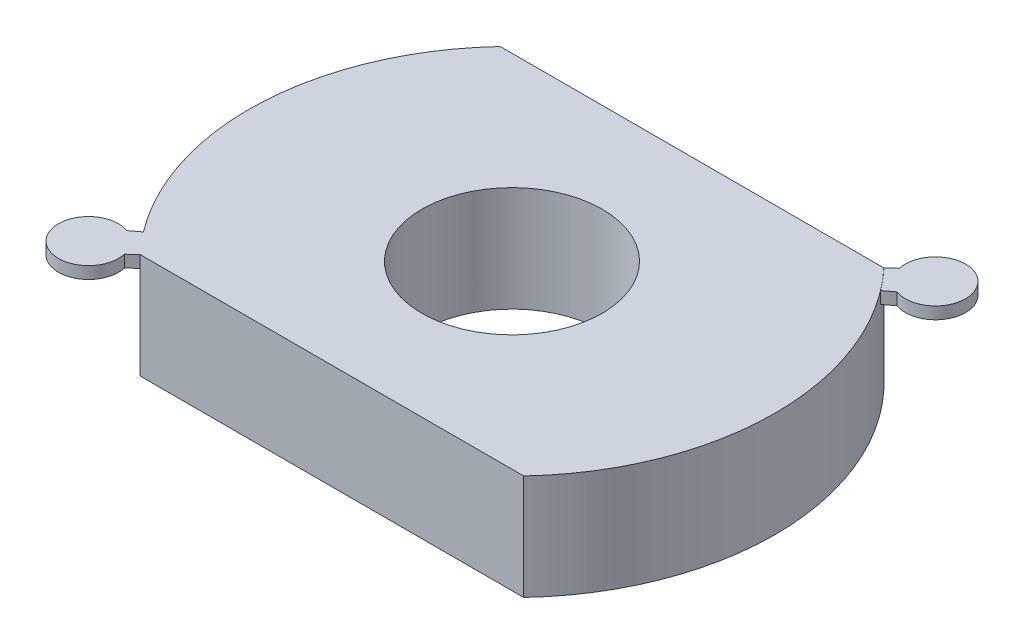
ISO-10303-21;
HEADER;
FILE_DESCRIPTION(('STEP AP214'),'2;1');
FILE_NAME('part.step','',(''),(''),'','','');
FILE_SCHEMA(('AUTOMOTIVE_DESIGN { 1 0 10303 214 1 1 1 1 }'));
ENDSEC;
DATA;
#1=APPLICATION_CONTEXT('core data for automotive mechanical design processes');
#2=APPLICATION_PROTOCOL_DEFINITION('international standard','automotive_design',2000,#1);
#3=PRODUCT_CONTEXT('',#1,'mechanical');
#4=PRODUCT('Part','Part','',(#3));
#5=PRODUCT_RELATED_PRODUCT_CATEGORY('part','',(#4));
#6=PRODUCT_DEFINITION_FORMATION('','',#4);
#7=PRODUCT_DEFINITION_CONTEXT('part definition',#1,'design');
#8=PRODUCT_DEFINITION('design','',#6,#7);
#9=PRODUCT_DEFINITION_SHAPE('','',#8);
#10=(LENGTH_UNIT() NAMED_UNIT(*) SI_UNIT(.MILLI.,.METRE.));
#11=(NAMED_UNIT(*) PLANE_ANGLE_UNIT() SI_UNIT($,.RADIAN.));
#12=(NAMED_UNIT(*) SI_UNIT($,.STERADIAN.) SOLID_ANGLE_UNIT());
#13=UNCERTAINTY_MEASURE_WITH_UNIT(LENGTH_MEASURE(1.E-05),#10,'distance_accuracy_value','');
#14=(GEOMETRIC_REPRESENTATION_CONTEXT(3) GLOBAL_UNCERTAINTY_ASSIGNED_CONTEXT((#13)) GLOBAL_UNIT_ASSIGNED_CONTEXT((#10,
#11,#12)) REPRESENTATION_CONTEXT('',''));
#15=CARTESIAN_POINT('',(0.,0.,0.));
#16=DIRECTION('',(0.,0.,1.));
#17=DIRECTION('',(1.,0.,0.));
#18=AXIS2_PLACEMENT_3D('',#15,#16,#17);
#19=CARTESIAN_POINT('',(1524.5473496291,620.,-1292.27368222175));
#20=DIRECTION('',(0.,1.,0.));
#21=DIRECTION('',(0.,0.,1.));
#22=AXIS2_PLACEMENT_3D('',#19,#20,#21);
#23=CYLINDRICAL_SURFACE('',#22,199.999999999983);
#24=CARTESIAN_POINT('',(1524.5473496291,700.,-1292.27368222175));
#25=DIRECTION('',(0.,1.,0.));
#26=DIRECTION('',(0.,0.,1.));
#27=AXIS2_PLACEMENT_3D('',#24,#25,#26);
#28=CIRCLE('',#27,199.999999999983);
#29=CARTESIAN_POINT('',(1329.42736665717,700.,-1248.36249634589));
#30=VERTEX_POINT('',#29);
#31=CARTESIAN_POINT('',(1456.88666030893,700.,-1104.06626706306));
#32=VERTEX_POINT('',#31);
#33=EDGE_CURVE('E116',#30,#32,#28,.F.);
#34=ORIENTED_EDGE('',*,*,#33,.T.);
#35=DIRECTION('',(0.,1.,0.));
#36=VECTOR('',#35,1.);
#37=CARTESIAN_POINT('',(1456.88666030893,620.,-1104.06626706306));
#38=LINE('',#37,#36);
#39=CARTESIAN_POINT('',(1456.88666030893,620.,-1104.06626706306));
#40=VERTEX_POINT('',#39);
#41=EDGE_CURVE('E12',#40,#32,#38,.T.);
#42=ORIENTED_EDGE('',*,*,#41,.F.);
#43=CARTESIAN_POINT('',(1524.5473496291,620.,-1292.27368222175));
#44=DIRECTION('',(0.,1.,0.));
#45=DIRECTION('',(0.,0.,1.));
#46=AXIS2_PLACEMENT_3D('',#43,#44,#45);
#47=CIRCLE('',#46,199.999999999983);
#48=CARTESIAN_POINT('',(1329.42736665717,620.,-1248.36249634589));
#49=VERTEX_POINT('',#48);
#50=EDGE_CURVE('E109',#49,#40,#47,.F.);
#51=ORIENTED_EDGE('',*,*,#50,.F.);
#52=DIRECTION('',(0.,1.,0.));
#53=VECTOR('',#52,1.);
#54=CARTESIAN_POINT('',(1329.42736665717,620.,-1248.36249634589));
#55=LINE('',#54,#53);
#56=EDGE_CURVE('E55',#49,#30,#55,.T.);
#57=ORIENTED_EDGE('',*,*,#56,.T.);
#58=EDGE_LOOP('',(#34,#42,#51,#57));
#59=FACE_BOUND('',#58,.T.);
#60=ADVANCED_FACE('F52',(#59),#23,.T.);
#61=CARTESIAN_POINT('',(4.88836242231465E-11,620.,6.45050955389637E-11));
#62=DIRECTION('',(-0.603984284872104,0.,-0.796996225604321));
#63=DIRECTION('',(-0.796996225604321,0.,0.603984284872104));
#64=AXIS2_PLACEMENT_3D('',#61,#62,#63);
#65=PLANE('',#64);
#66=DIRECTION('',(-0.796996225604321,0.,0.603984284872104));
#67=VECTOR('',#66,1.);
#68=CARTESIAN_POINT('',(4.88836242231465E-11,700.,6.45050955389637E-11));
#69=LINE('',#68,#67);
#70=CARTESIAN_POINT('',(1394.74339480761,700.,-1056.97249852612));
#71=VERTEX_POINT('',#70);
#72=EDGE_CURVE('E91',#32,#71,#69,.T.);
#73=ORIENTED_EDGE('',*,*,#72,.T.);
#74=DIRECTION('',(0.,1.,0.));
#75=VECTOR('',#74,1.);
#76=CARTESIAN_POINT('',(1394.74339480761,620.,-1056.97249852612));
#77=LINE('',#76,#75);
#78=CARTESIAN_POINT('',(1394.74339480761,620.,-1056.97249852612));
#79=VERTEX_POINT('',#78);
#80=EDGE_CURVE('E61',#79,#71,#77,.T.);
#81=ORIENTED_EDGE('',*,*,#80,.F.);
#82=DIRECTION('',(-0.796996225604321,0.,0.603984284872104));
#83=VECTOR('',#82,1.);
#84=CARTESIAN_POINT('',(4.88836242231465E-11,620.,6.45050955389637E-11));
#85=LINE('',#84,#83);
#86=EDGE_CURVE('E69',#40,#79,#85,.T.);
#87=ORIENTED_EDGE('',*,*,#86,.F.);
#88=ORIENTED_EDGE('',*,*,#41,.T.);
#89=EDGE_LOOP('',(#73,#81,#87,#88));
#90=FACE_BOUND('',#89,.T.);
#91=ADVANCED_FACE('F125',(#90),#65,.F.);
#92=CARTESIAN_POINT('',(24.3381209025004,620.,-22.8540483878106));
#93=DIRECTION('',(0.,1.,0.));
#94=DIRECTION('',(0.,0.,1.));
#95=AXIS2_PLACEMENT_3D('',#92,#93,#94);
#96=CYLINDRICAL_SURFACE('',#95,1716.80272124184);
#97=CARTESIAN_POINT('',(24.3381209025004,700.,-22.8540483878106));
#98=DIRECTION('',(0.,1.,0.));
#99=DIRECTION('',(0.,0.,1.));
#100=AXIS2_PLACEMENT_3D('',#97,#98,#99);
#101=CIRCLE('',#100,1716.80272124184);
#102=CARTESIAN_POINT('',(1275.85829372899,700.,-1198.05992));
#103=VERTEX_POINT('',#102);
#104=EDGE_CURVE('E103',#103,#71,#101,.F.);
#105=ORIENTED_EDGE('',*,*,#104,.F.);
#106=DIRECTION('',(0.,1.,0.));
#107=VECTOR('',#106,1.);
#108=CARTESIAN_POINT('',(1275.85829372899,620.,-1198.05992));
#109=LINE('',#108,#107);
#110=CARTESIAN_POINT('',(1275.85829372899,620.,-1198.05992));
#111=VERTEX_POINT('',#110);
#112=EDGE_CURVE('E100',#111,#103,#109,.T.);
#113=ORIENTED_EDGE('',*,*,#112,.F.);
#114=CARTESIAN_POINT('',(24.3381209025004,620.,-22.8540483878106));
#115=DIRECTION('',(0.,1.,0.));
#116=DIRECTION('',(0.,0.,1.));
#117=AXIS2_PLACEMENT_3D('',#114,#115,#116);
#118=CIRCLE('',#117,1716.80272124184);
#119=EDGE_CURVE('E102',#111,#79,#118,.F.);
#120=ORIENTED_EDGE('',*,*,#119,.T.);
#121=ORIENTED_EDGE('',*,*,#80,.T.);
#122=EDGE_LOOP('',(#105,#113,#120,#121));
#123=FACE_BOUND('',#122,.T.);
#124=ADVANCED_FACE('F101',(#123),#96,.F.);
#125=CARTESIAN_POINT('',(2.38026627226479E-10,620.,2.53483353716665E-10));
#126=DIRECTION('',(0.684531692006019,0.,0.728983101751595));
#127=DIRECTION('',(0.728983101751595,0.,-0.684531692006019));
#128=AXIS2_PLACEMENT_3D('',#125,#126,#127);
#129=PLANE('',#128);
#130=DIRECTION('',(0.728983101751595,0.,-0.684531692006019));
#131=VECTOR('',#130,1.);
#132=CARTESIAN_POINT('',(2.38026627226479E-10,700.,2.53483353716665E-10));
#133=LINE('',#132,#131);
#134=EDGE_CURVE('E119',#103,#30,#133,.T.);
#135=ORIENTED_EDGE('',*,*,#134,.T.);
#136=ORIENTED_EDGE('',*,*,#56,.F.);
#137=DIRECTION('',(0.728983101751595,0.,-0.684531692006019));
#138=VECTOR('',#137,1.);
#139=CARTESIAN_POINT('',(2.38026627226479E-10,620.,2.53483353716665E-10));
#140=LINE('',#139,#138);
#141=EDGE_CURVE('E97',#111,#49,#140,.T.);
#142=ORIENTED_EDGE('',*,*,#141,.F.);
#143=ORIENTED_EDGE('',*,*,#112,.T.);
#144=EDGE_LOOP('',(#135,#136,#142,#143));
#145=FACE_BOUND('',#144,.T.);
#146=ADVANCED_FACE('F106',(#145),#129,.F.);
#147=CARTESIAN_POINT('',(0.,620.,0.));
#148=DIRECTION('',(0.,1.,0.));
#149=DIRECTION('',(0.,0.,1.));
#150=AXIS2_PLACEMENT_3D('',#147,#148,#149);
#151=PLANE('',#150);
#152=ORIENTED_EDGE('',*,*,#50,.T.);
#153=ORIENTED_EDGE('',*,*,#86,.T.);
#154=ORIENTED_EDGE('',*,*,#119,.F.);
#155=ORIENTED_EDGE('',*,*,#141,.T.);
#156=EDGE_LOOP('',(#152,#153,#154,#155));
#157=FACE_BOUND('',#156,.T.);
#158=ADVANCED_FACE('F111',(#157),#151,.F.);
#159=CARTESIAN_POINT('',(0.,700.,0.));
#160=DIRECTION('',(0.,1.,0.));
#161=DIRECTION('',(0.,0.,1.));
#162=AXIS2_PLACEMENT_3D('',#159,#160,#161);
#163=PLANE('',#162);
#164=ORIENTED_EDGE('',*,*,#33,.F.);
#165=ORIENTED_EDGE('',*,*,#134,.F.);
#166=ORIENTED_EDGE('',*,*,#104,.T.);
#167=ORIENTED_EDGE('',*,*,#72,.F.);
#168=EDGE_LOOP('',(#164,#165,#166,#167));
#169=FACE_BOUND('',#168,.T.);
#170=ADVANCED_FACE('F134',(#169),#163,.T.);
#171=CLOSED_SHELL('',(#60,#91,#124,#146,#158,#170));
#172=MANIFOLD_SOLID_BREP('B2',#171);
#173=CARTESIAN_POINT('',(0.,700.,0.));
#174=DIRECTION('',(0.,-1.,0.));
#175=DIRECTION('',(0.,0.,-1.));
#176=AXIS2_PLACEMENT_3D('',#173,#174,#175);
#177=CYLINDRICAL_SURFACE('',#176,1750.);
#178=DIRECTION('',(0.,1.,0.));
#179=VECTOR('',#178,1.);
#180=CARTESIAN_POINT('',(-1394.74339480756,620.,1056.97249852618));
#181=LINE('',#180,#179);
#182=CARTESIAN_POINT('',(-1394.74339480756,620.,1056.97249852618));
#183=VERTEX_POINT('',#182);
#184=CARTESIAN_POINT('',(-1394.74339480756,700.,1056.97249852618));
#185=VERTEX_POINT('',#184);
#186=EDGE_CURVE('E353',#183,#185,#181,.T.);
#187=ORIENTED_EDGE('',*,*,#186,.T.);
#188=CARTESIAN_POINT('',(0.,700.,0.));
#189=DIRECTION('',(0.,1.,0.));
#190=DIRECTION('',(0.,0.,1.));
#191=AXIS2_PLACEMENT_3D('',#188,#189,#190);
#192=CIRCLE('',#191,1750.);
#193=CARTESIAN_POINT('',(-1275.59885077151,700.,-1198.05992));
#194=VERTEX_POINT('',#193);
#195=EDGE_CURVE('E442',#194,#185,#192,.T.);
#196=ORIENTED_EDGE('',*,*,#195,.F.);
#197=DIRECTION('',(0.,-1.,0.));
#198=VECTOR('',#197,1.);
#199=CARTESIAN_POINT('',(-1275.59885077151,700.,-1198.05992));
#200=LINE('',#199,#198);
#201=CARTESIAN_POINT('',(-1275.59885077151,0.,-1198.05992));
#202=VERTEX_POINT('',#201);
#203=EDGE_CURVE('E431',#202,#194,#200,.F.);
#204=ORIENTED_EDGE('',*,*,#203,.F.);
#205=CARTESIAN_POINT('',(0.,0.,0.));
#206=DIRECTION('',(0.,1.,0.));
#207=DIRECTION('',(0.,0.,1.));
#208=AXIS2_PLACEMENT_3D('',#205,#206,#207);
#209=CIRCLE('',#208,1750.);
#210=CARTESIAN_POINT('',(-1275.59885077151,0.,1198.05992));
#211=VERTEX_POINT('',#210);
#212=EDGE_CURVE('E437',#202,#211,#209,.T.);
#213=ORIENTED_EDGE('',*,*,#212,.T.);
#214=DIRECTION('',(0.,-1.,0.));
#215=VECTOR('',#214,1.);
#216=CARTESIAN_POINT('',(-1275.59885077151,700.,1198.05992));
#217=LINE('',#216,#215);
#218=CARTESIAN_POINT('',(-1275.59885077151,700.,1198.05992));
#219=VERTEX_POINT('',#218);
#220=EDGE_CURVE('E428',#219,#211,#217,.T.);
#221=ORIENTED_EDGE('',*,*,#220,.F.);
#222=CARTESIAN_POINT('',(-1275.72042806553,700.,1197.93046101028));
#223=VERTEX_POINT('',#222);
#224=EDGE_CURVE('E443',#223,#219,#192,.T.);
#225=ORIENTED_EDGE('',*,*,#224,.F.);
#226=DIRECTION('',(0.,1.,0.));
#227=VECTOR('',#226,1.);
#228=CARTESIAN_POINT('',(-1275.72042806553,620.,1197.93046101028));
#229=LINE('',#228,#227);
#230=CARTESIAN_POINT('',(-1275.72042806553,620.,1197.93046101028));
#231=VERTEX_POINT('',#230);
#232=EDGE_CURVE('E357',#231,#223,#229,.T.);
#233=ORIENTED_EDGE('',*,*,#232,.F.);
#234=CARTESIAN_POINT('',(0.,620.,0.));
#235=DIRECTION('',(0.,1.,0.));
#236=DIRECTION('',(0.,0.,1.));
#237=AXIS2_PLACEMENT_3D('',#234,#235,#236);
#238=CIRCLE('',#237,1750.);
#239=EDGE_CURVE('E337',#183,#231,#238,.T.);
#240=ORIENTED_EDGE('',*,*,#239,.F.);
#241=EDGE_LOOP('',(#187,#196,#204,#213,#221,#225,#233,#240));
#242=FACE_BOUND('',#241,.T.);
#243=ADVANCED_FACE('F179',(#242),#177,.T.);
#244=CARTESIAN_POINT('',(0.,0.,0.));
#245=DIRECTION('',(0.,1.,0.));
#246=DIRECTION('',(0.,0.,1.));
#247=AXIS2_PLACEMENT_3D('',#244,#245,#246);
#248=PLANE('',#247);
#249=CARTESIAN_POINT('',(0.,0.,0.));
#250=DIRECTION('',(0.,1.,0.));
#251=DIRECTION('',(0.,0.,1.));
#252=AXIS2_PLACEMENT_3D('',#249,#250,#251);
#253=CIRCLE('',#252,600.);
#254=CARTESIAN_POINT('',(0.,0.,600.));
#255=VERTEX_POINT('',#254);
#256=EDGE_CURVE('E183',#255,#255,#253,.T.);
#257=ORIENTED_EDGE('',*,*,#256,.T.);
#258=EDGE_LOOP('',(#257));
#259=FACE_BOUND('',#258,.T.);
#260=CARTESIAN_POINT('',(0.,0.,0.));
#261=DIRECTION('',(0.,1.,0.));
#262=DIRECTION('',(0.,0.,1.));
#263=AXIS2_PLACEMENT_3D('',#260,#261,#262);
#264=CIRCLE('',#263,601.5);
#265=CARTESIAN_POINT('',(0.,0.,601.5));
#266=VERTEX_POINT('',#265);
#267=EDGE_CURVE('E383',#266,#266,#264,.T.);
#268=ORIENTED_EDGE('',*,*,#267,.F.);
#269=EDGE_LOOP('',(#268));
#270=FACE_BOUND('',#269,.T.);
#271=ADVANCED_FACE('F506',(#259,#270),#248,.F.);
#272=DIRECTION('',(0.,-1.,0.));
#273=VECTOR('',#272,1.);
#274=CARTESIAN_POINT('',(1275.59885077151,700.,-1198.05992));
#275=LINE('',#274,#273);
#276=CARTESIAN_POINT('',(1275.59885077151,700.,-1198.05992));
#277=VERTEX_POINT('',#276);
#278=CARTESIAN_POINT('',(1275.59885077151,0.,-1198.05992));
#279=VERTEX_POINT('',#278);
#280=EDGE_CURVE('E434',#277,#279,#275,.T.);
#281=ORIENTED_EDGE('',*,*,#280,.F.);
#282=CARTESIAN_POINT('',(1275.59885077151,700.,1198.05992));
#283=VERTEX_POINT('',#282);
#284=EDGE_CURVE('E438',#283,#277,#192,.T.);
#285=ORIENTED_EDGE('',*,*,#284,.F.);
#286=DIRECTION('',(0.,-1.,0.));
#287=VECTOR('',#286,1.);
#288=CARTESIAN_POINT('',(1275.59885077151,700.,1198.05992));
#289=LINE('',#288,#287);
#290=CARTESIAN_POINT('',(1275.59885077151,0.,1198.05992));
#291=VERTEX_POINT('',#290);
#292=EDGE_CURVE('E425',#291,#283,#289,.F.);
#293=ORIENTED_EDGE('',*,*,#292,.F.);
#294=EDGE_CURVE('E444',#291,#279,#209,.T.);
#295=ORIENTED_EDGE('',*,*,#294,.T.);
#296=EDGE_LOOP('',(#281,#285,#293,#295));
#297=FACE_BOUND('',#296,.T.);
#298=ADVANCED_FACE('F181',(#297),#177,.T.);
#299=CARTESIAN_POINT('',(0.,700.,0.));
#300=DIRECTION('',(0.,1.,0.));
#301=DIRECTION('',(0.,0.,1.));
#302=AXIS2_PLACEMENT_3D('',#299,#300,#301);
#303=PLANE('',#302);
#304=CARTESIAN_POINT('',(0.,700.,0.));
#305=DIRECTION('',(0.,-1.,0.));
#306=DIRECTION('',(0.,0.,-1.));
#307=AXIS2_PLACEMENT_3D('',#304,#305,#306);
#308=CIRCLE('',#307,600.);
#309=CARTESIAN_POINT('',(0.,700.,-600.));
#310=VERTEX_POINT('',#309);
#311=EDGE_CURVE('E411',#310,#310,#308,.T.);
#312=ORIENTED_EDGE('',*,*,#311,.T.);
#313=EDGE_LOOP('',(#312));
#314=FACE_BOUND('',#313,.T.);
#315=ORIENTED_EDGE('',*,*,#284,.T.);
#316=DIRECTION('',(1.,0.,0.));
#317=VECTOR('',#316,1.);
#318=CARTESIAN_POINT('',(-2106.31185916349,700.,-1198.05992));
#319=LINE('',#318,#317);
#320=EDGE_CURVE('E422',#194,#277,#319,.T.);
#321=ORIENTED_EDGE('',*,*,#320,.F.);
#322=ORIENTED_EDGE('',*,*,#195,.T.);
#323=DIRECTION('',(0.796996225604323,0.,-0.603984284872101));
#324=VECTOR('',#323,1.);
#325=CARTESIAN_POINT('',(0.,700.,0.));
#326=LINE('',#325,#324);
#327=CARTESIAN_POINT('',(-1456.88666030887,700.,1104.06626706312));
#328=VERTEX_POINT('',#327);
#329=EDGE_CURVE('E334',#328,#185,#326,.T.);
#330=ORIENTED_EDGE('',*,*,#329,.F.);
#331=CARTESIAN_POINT('',(-1524.54734962911,700.,1292.27368222179));
#332=DIRECTION('',(0.,1.,0.));
#333=DIRECTION('',(0.,0.,1.));
#334=AXIS2_PLACEMENT_3D('',#331,#332,#333);
#335=CIRCLE('',#334,199.99999999999);
#336=CARTESIAN_POINT('',(-1329.42736665717,700.,1248.36249634588));
#337=VERTEX_POINT('',#336);
#338=EDGE_CURVE('E318',#337,#328,#335,.F.);
#339=ORIENTED_EDGE('',*,*,#338,.F.);
#340=DIRECTION('',(-0.728983101751731,0.,0.684531692005875));
#341=VECTOR('',#340,1.);
#342=CARTESIAN_POINT('',(0.,700.,0.));
#343=LINE('',#342,#341);
#344=EDGE_CURVE('E323',#223,#337,#343,.T.);
#345=ORIENTED_EDGE('',*,*,#344,.F.);
#346=ORIENTED_EDGE('',*,*,#224,.T.);
#347=DIRECTION('',(-1.,0.,0.));
#348=VECTOR('',#347,1.);
#349=CARTESIAN_POINT('',(-2106.31185916349,700.,1198.05992));
#350=LINE('',#349,#348);
#351=EDGE_CURVE('E418',#283,#219,#350,.T.);
#352=ORIENTED_EDGE('',*,*,#351,.F.);
#353=EDGE_LOOP('',(#315,#321,#322,#330,#339,#345,#346,#352));
#354=FACE_BOUND('',#353,.T.);
#355=ADVANCED_FACE('F477',(#314,#354),#303,.T.);
#356=CARTESIAN_POINT('',(0.,0.,0.));
#357=DIRECTION('',(0.,1.,0.));
#358=DIRECTION('',(0.,0.,1.));
#359=AXIS2_PLACEMENT_3D('',#356,#357,#358);
#360=CIRCLE('',#359,1748.5);
#361=CARTESIAN_POINT('',(1274.9496491429,0.,1196.55992));
#362=VERTEX_POINT('',#361);
#363=CARTESIAN_POINT('',(1274.9496491429,0.,-1196.55992));
#364=VERTEX_POINT('',#363);
#365=EDGE_CURVE('E390',#362,#364,#360,.T.);
#366=ORIENTED_EDGE('',*,*,#365,.T.);
#367=DIRECTION('',(-1.,0.,0.));
#368=VECTOR('',#367,1.);
#369=CARTESIAN_POINT('',(0.,0.,-1196.55992));
#370=LINE('',#369,#368);
#371=CARTESIAN_POINT('',(-1274.9496491429,0.,-1196.55992));
#372=VERTEX_POINT('',#371);
#373=EDGE_CURVE('E404',#364,#372,#370,.T.);
#374=ORIENTED_EDGE('',*,*,#373,.T.);
#375=CARTESIAN_POINT('',(0.,0.,0.));
#376=DIRECTION('',(0.,1.,0.));
#377=DIRECTION('',(0.,0.,1.));
#378=AXIS2_PLACEMENT_3D('',#375,#376,#377);
#379=CIRCLE('',#378,1748.5);
#380=CARTESIAN_POINT('',(-1274.9496491429,0.,1196.55992));
#381=VERTEX_POINT('',#380);
#382=EDGE_CURVE('E367',#372,#381,#379,.T.);
#383=ORIENTED_EDGE('',*,*,#382,.T.);
#384=DIRECTION('',(1.,0.,0.));
#385=VECTOR('',#384,1.);
#386=CARTESIAN_POINT('',(0.,0.,1196.55992));
#387=LINE('',#386,#385);
#388=EDGE_CURVE('E373',#381,#362,#387,.T.);
#389=ORIENTED_EDGE('',*,*,#388,.T.);
#390=EDGE_LOOP('',(#366,#374,#383,#389));
#391=FACE_BOUND('',#390,.T.);
#392=DIRECTION('',(-1.,0.,0.));
#393=VECTOR('',#392,1.);
#394=CARTESIAN_POINT('',(0.,0.,-1198.05992));
#395=LINE('',#394,#393);
#396=EDGE_CURVE('E50',#279,#202,#395,.T.);
#397=ORIENTED_EDGE('',*,*,#396,.F.);
#398=ORIENTED_EDGE('',*,*,#294,.F.);
#399=DIRECTION('',(1.,0.,0.));
#400=VECTOR('',#399,1.);
#401=CARTESIAN_POINT('',(0.,0.,1198.05992));
#402=LINE('',#401,#400);
#403=EDGE_CURVE('E189',#211,#291,#402,.T.);
#404=ORIENTED_EDGE('',*,*,#403,.F.);
#405=ORIENTED_EDGE('',*,*,#212,.F.);
#406=EDGE_LOOP('',(#397,#398,#404,#405));
#407=FACE_BOUND('',#406,.T.);
#408=ADVANCED_FACE('F463',(#391,#407),#248,.F.);
#409=CARTESIAN_POINT('',(-2106.31185916349,700.,1198.05992));
#410=DIRECTION('',(0.,0.,1.));
#411=DIRECTION('',(1.,0.,0.));
#412=AXIS2_PLACEMENT_3D('',#409,#410,#411);
#413=PLANE('',#412);
#414=ORIENTED_EDGE('',*,*,#220,.T.);
#415=ORIENTED_EDGE('',*,*,#403,.T.);
#416=ORIENTED_EDGE('',*,*,#292,.T.);
#417=ORIENTED_EDGE('',*,*,#351,.T.);
#418=EDGE_LOOP('',(#414,#415,#416,#417));
#419=FACE_BOUND('',#418,.T.);
#420=ADVANCED_FACE('F452',(#419),#413,.T.);
#421=CARTESIAN_POINT('',(-2106.31185916349,700.,-1198.05992));
#422=DIRECTION('',(0.,0.,-1.));
#423=DIRECTION('',(-1.,0.,0.));
#424=AXIS2_PLACEMENT_3D('',#421,#422,#423);
#425=PLANE('',#424);
#426=ORIENTED_EDGE('',*,*,#280,.T.);
#427=ORIENTED_EDGE('',*,*,#396,.T.);
#428=ORIENTED_EDGE('',*,*,#203,.T.);
#429=ORIENTED_EDGE('',*,*,#320,.T.);
#430=EDGE_LOOP('',(#426,#427,#428,#429));
#431=FACE_BOUND('',#430,.T.);
#432=ADVANCED_FACE('F466',(#431),#425,.T.);
#433=CARTESIAN_POINT('',(0.,700.,0.));
#434=DIRECTION('',(0.,-1.,0.));
#435=DIRECTION('',(0.,0.,-1.));
#436=AXIS2_PLACEMENT_3D('',#433,#434,#435);
#437=CYLINDRICAL_SURFACE('',#436,600.);
#438=ORIENTED_EDGE('',*,*,#311,.F.);
#439=EDGE_LOOP('',(#438));
#440=FACE_BOUND('',#439,.T.);
#441=ORIENTED_EDGE('',*,*,#256,.F.);
#442=EDGE_LOOP('',(#441));
#443=FACE_BOUND('',#442,.T.);
#444=ADVANCED_FACE('F526',(#440,#443),#437,.F.);
#445=CARTESIAN_POINT('',(0.,700.,0.));
#446=DIRECTION('',(0.,-1.,0.));
#447=DIRECTION('',(0.,0.,-1.));
#448=AXIS2_PLACEMENT_3D('',#445,#446,#447);
#449=CYLINDRICAL_SURFACE('',#448,1748.5);
#450=DIRECTION('',(0.,-1.,0.));
#451=VECTOR('',#450,1.);
#452=CARTESIAN_POINT('',(1274.9496491429,698.5,-1196.55992));
#453=LINE('',#452,#451);
#454=CARTESIAN_POINT('',(1274.9496491429,698.5,-1196.55992));
#455=VERTEX_POINT('',#454);
#456=EDGE_CURVE('E364',#455,#364,#453,.T.);
#457=ORIENTED_EDGE('',*,*,#456,.T.);
#458=ORIENTED_EDGE('',*,*,#365,.F.);
#459=DIRECTION('',(0.,-1.,0.));
#460=VECTOR('',#459,1.);
#461=CARTESIAN_POINT('',(1274.9496491429,0.,1196.55992));
#462=LINE('',#461,#460);
#463=CARTESIAN_POINT('',(1274.9496491429,698.5,1196.55992));
#464=VERTEX_POINT('',#463);
#465=EDGE_CURVE('E375',#362,#464,#462,.F.);
#466=ORIENTED_EDGE('',*,*,#465,.T.);
#467=CARTESIAN_POINT('',(0.,698.5,0.));
#468=DIRECTION('',(0.,1.,0.));
#469=DIRECTION('',(0.,0.,1.));
#470=AXIS2_PLACEMENT_3D('',#467,#468,#469);
#471=CIRCLE('',#470,1748.5);
#472=EDGE_CURVE('E369',#464,#455,#471,.T.);
#473=ORIENTED_EDGE('',*,*,#472,.T.);
#474=EDGE_LOOP('',(#457,#458,#466,#473));
#475=FACE_BOUND('',#474,.T.);
#476=ADVANCED_FACE('F528',(#475),#449,.F.);
#477=DIRECTION('',(0.,-1.,0.));
#478=VECTOR('',#477,1.);
#479=CARTESIAN_POINT('',(-1274.9496491429,0.,-1196.55992));
#480=LINE('',#479,#478);
#481=CARTESIAN_POINT('',(-1274.9496491429,698.5,-1196.55992));
#482=VERTEX_POINT('',#481);
#483=EDGE_CURVE('E368',#372,#482,#480,.F.);
#484=ORIENTED_EDGE('',*,*,#483,.T.);
#485=CARTESIAN_POINT('',(0.,698.5,0.));
#486=DIRECTION('',(0.,1.,0.));
#487=DIRECTION('',(0.,0.,1.));
#488=AXIS2_PLACEMENT_3D('',#485,#486,#487);
#489=CIRCLE('',#488,1748.5);
#490=CARTESIAN_POINT('',(-1274.9496491429,698.5,1196.55992));
#491=VERTEX_POINT('',#490);
#492=EDGE_CURVE('E374',#482,#491,#489,.T.);
#493=ORIENTED_EDGE('',*,*,#492,.T.);
#494=DIRECTION('',(0.,-1.,0.));
#495=VECTOR('',#494,1.);
#496=CARTESIAN_POINT('',(-1274.9496491429,698.5,1196.55992));
#497=LINE('',#496,#495);
#498=EDGE_CURVE('E378',#491,#381,#497,.T.);
#499=ORIENTED_EDGE('',*,*,#498,.T.);
#500=ORIENTED_EDGE('',*,*,#382,.F.);
#501=EDGE_LOOP('',(#484,#493,#499,#500));
#502=FACE_BOUND('',#501,.T.);
#503=ADVANCED_FACE('F540',(#502),#449,.F.);
#504=CARTESIAN_POINT('',(0.,698.5,0.));
#505=DIRECTION('',(0.,1.,0.));
#506=DIRECTION('',(0.,0.,1.));
#507=AXIS2_PLACEMENT_3D('',#504,#505,#506);
#508=PLANE('',#507);
#509=DIRECTION('',(0.,0.,1.));
#510=VECTOR('',#509,1.);
#511=CARTESIAN_POINT('',(-838.224823524824,698.5,0.));
#512=LINE('',#511,#510);
#513=CARTESIAN_POINT('',(-838.224823524824,698.5,498.279958140397));
#514=VERTEX_POINT('',#513);
#515=CARTESIAN_POINT('',(-838.224823524824,698.5,698.279958140397));
#516=VERTEX_POINT('',#515);
#517=EDGE_CURVE('E316',#514,#516,#512,.T.);
#518=ORIENTED_EDGE('',*,*,#517,.F.);
#519=DIRECTION('',(1.,0.,0.));
#520=VECTOR('',#519,1.);
#521=CARTESIAN_POINT('',(0.,698.5,498.279958140397));
#522=LINE('',#521,#520);
#523=CARTESIAN_POINT('',(-1038.22482352482,698.5,498.279958140397));
#524=VERTEX_POINT('',#523);
#525=EDGE_CURVE('E681',#524,#514,#522,.T.);
#526=ORIENTED_EDGE('',*,*,#525,.F.);
#527=DIRECTION('',(0.,0.,-1.));
#528=VECTOR('',#527,1.);
#529=CARTESIAN_POINT('',(-1038.22482352482,698.5,0.));
#530=LINE('',#529,#528);
#531=CARTESIAN_POINT('',(-1038.22482352482,698.5,698.279958140397));
#532=VERTEX_POINT('',#531);
#533=EDGE_CURVE('E201',#532,#524,#530,.T.);
#534=ORIENTED_EDGE('',*,*,#533,.F.);
#535=DIRECTION('',(-1.,0.,0.));
#536=VECTOR('',#535,1.);
#537=CARTESIAN_POINT('',(0.,698.5,698.279958140397));
#538=LINE('',#537,#536);
#539=EDGE_CURVE('E196',#516,#532,#538,.T.);
#540=ORIENTED_EDGE('',*,*,#539,.F.);
#541=EDGE_LOOP('',(#518,#526,#534,#540));
#542=FACE_BOUND('',#541,.T.);
#543=CARTESIAN_POINT('',(0.,698.5,0.));
#544=DIRECTION('',(0.,1.,0.));
#545=DIRECTION('',(0.,0.,1.));
#546=AXIS2_PLACEMENT_3D('',#543,#544,#545);
#547=CIRCLE('',#546,601.5);
#548=CARTESIAN_POINT('',(0.,698.5,601.5));
#549=VERTEX_POINT('',#548);
#550=EDGE_CURVE('E352',#549,#549,#547,.F.);
#551=ORIENTED_EDGE('',*,*,#550,.F.);
#552=EDGE_LOOP('',(#551));
#553=FACE_BOUND('',#552,.T.);
#554=ORIENTED_EDGE('',*,*,#472,.F.);
#555=DIRECTION('',(-1.,0.,0.));
#556=VECTOR('',#555,1.);
#557=CARTESIAN_POINT('',(-2106.31185916349,698.5,1196.55992));
#558=LINE('',#557,#556);
#559=EDGE_CURVE('E386',#464,#491,#558,.T.);
#560=ORIENTED_EDGE('',*,*,#559,.T.);
#561=ORIENTED_EDGE('',*,*,#492,.F.);
#562=DIRECTION('',(1.,0.,0.));
#563=VECTOR('',#562,1.);
#564=CARTESIAN_POINT('',(-2106.31185916349,698.5,-1196.55992));
#565=LINE('',#564,#563);
#566=EDGE_CURVE('E379',#482,#455,#565,.T.);
#567=ORIENTED_EDGE('',*,*,#566,.T.);
#568=EDGE_LOOP('',(#554,#560,#561,#567));
#569=FACE_BOUND('',#568,.T.);
#570=ADVANCED_FACE('F537',(#542,#553,#569),#508,.F.);
#571=CARTESIAN_POINT('',(-2106.31185916349,700.,1196.55992));
#572=DIRECTION('',(0.,0.,1.));
#573=DIRECTION('',(1.,0.,0.));
#574=AXIS2_PLACEMENT_3D('',#571,#572,#573);
#575=PLANE('',#574);
#576=ORIENTED_EDGE('',*,*,#498,.F.);
#577=ORIENTED_EDGE('',*,*,#559,.F.);
#578=ORIENTED_EDGE('',*,*,#465,.F.);
#579=ORIENTED_EDGE('',*,*,#388,.F.);
#580=EDGE_LOOP('',(#576,#577,#578,#579));
#581=FACE_BOUND('',#580,.T.);
#582=ADVANCED_FACE('F533',(#581),#575,.F.);
#583=CARTESIAN_POINT('',(-2106.31185916349,700.,-1196.55992));
#584=DIRECTION('',(0.,0.,-1.));
#585=DIRECTION('',(-1.,0.,0.));
#586=AXIS2_PLACEMENT_3D('',#583,#584,#585);
#587=PLANE('',#586);
#588=ORIENTED_EDGE('',*,*,#456,.F.);
#589=ORIENTED_EDGE('',*,*,#566,.F.);
#590=ORIENTED_EDGE('',*,*,#483,.F.);
#591=ORIENTED_EDGE('',*,*,#373,.F.);
#592=EDGE_LOOP('',(#588,#589,#590,#591));
#593=FACE_BOUND('',#592,.T.);
#594=ADVANCED_FACE('F500',(#593),#587,.F.);
#595=CARTESIAN_POINT('',(0.,700.,0.));
#596=DIRECTION('',(0.,-1.,0.));
#597=DIRECTION('',(0.,0.,-1.));
#598=AXIS2_PLACEMENT_3D('',#595,#596,#597);
#599=CYLINDRICAL_SURFACE('',#598,601.5);
#600=ORIENTED_EDGE('',*,*,#550,.T.);
#601=EDGE_LOOP('',(#600));
#602=FACE_BOUND('',#601,.T.);
#603=ORIENTED_EDGE('',*,*,#267,.T.);
#604=EDGE_LOOP('',(#603));
#605=FACE_BOUND('',#604,.T.);
#606=ADVANCED_FACE('F493',(#602,#605),#599,.T.);
#607=CARTESIAN_POINT('',(-1524.54734962911,620.,1292.27368222179));
#608=DIRECTION('',(0.,1.,0.));
#609=DIRECTION('',(0.,0.,1.));
#610=AXIS2_PLACEMENT_3D('',#607,#608,#609);
#611=CYLINDRICAL_SURFACE('',#610,199.99999999999);
#612=ORIENTED_EDGE('',*,*,#338,.T.);
#613=DIRECTION('',(0.,1.,0.));
#614=VECTOR('',#613,1.);
#615=CARTESIAN_POINT('',(-1456.88666030887,620.,1104.06626706312));
#616=LINE('',#615,#614);
#617=CARTESIAN_POINT('',(-1456.88666030887,620.,1104.06626706312));
#618=VERTEX_POINT('',#617);
#619=EDGE_CURVE('E348',#618,#328,#616,.T.);
#620=ORIENTED_EDGE('',*,*,#619,.F.);
#621=CARTESIAN_POINT('',(-1524.54734962911,620.,1292.27368222179));
#622=DIRECTION('',(0.,1.,0.));
#623=DIRECTION('',(0.,0.,1.));
#624=AXIS2_PLACEMENT_3D('',#621,#622,#623);
#625=CIRCLE('',#624,199.99999999999);
#626=CARTESIAN_POINT('',(-1329.42736665717,620.,1248.36249634588));
#627=VERTEX_POINT('',#626);
#628=EDGE_CURVE('E329',#627,#618,#625,.F.);
#629=ORIENTED_EDGE('',*,*,#628,.F.);
#630=DIRECTION('',(0.,1.,0.));
#631=VECTOR('',#630,1.);
#632=CARTESIAN_POINT('',(-1329.42736665717,620.,1248.36249634588));
#633=LINE('',#632,#631);
#634=EDGE_CURVE('E342',#627,#337,#633,.T.);
#635=ORIENTED_EDGE('',*,*,#634,.T.);
#636=EDGE_LOOP('',(#612,#620,#629,#635));
#637=FACE_BOUND('',#636,.T.);
#638=ADVANCED_FACE('F491',(#637),#611,.T.);
#639=CARTESIAN_POINT('',(0.,620.,0.));
#640=DIRECTION('',(0.603984284872101,0.,0.796996225604323));
#641=DIRECTION('',(0.796996225604323,0.,-0.603984284872101));
#642=AXIS2_PLACEMENT_3D('',#639,#640,#641);
#643=PLANE('',#642);
#644=ORIENTED_EDGE('',*,*,#329,.T.);
#645=ORIENTED_EDGE('',*,*,#186,.F.);
#646=DIRECTION('',(0.796996225604323,0.,-0.603984284872101));
#647=VECTOR('',#646,1.);
#648=CARTESIAN_POINT('',(0.,620.,0.));
#649=LINE('',#648,#647);
#650=EDGE_CURVE('E340',#618,#183,#649,.T.);
#651=ORIENTED_EDGE('',*,*,#650,.F.);
#652=ORIENTED_EDGE('',*,*,#619,.T.);
#653=EDGE_LOOP('',(#644,#645,#651,#652));
#654=FACE_BOUND('',#653,.T.);
#655=ADVANCED_FACE('F489',(#654),#643,.F.);
#656=CARTESIAN_POINT('',(0.,620.,0.));
#657=DIRECTION('',(-0.684531692005875,0.,-0.728983101751731));
#658=DIRECTION('',(-0.728983101751731,0.,0.684531692005875));
#659=AXIS2_PLACEMENT_3D('',#656,#657,#658);
#660=PLANE('',#659);
#661=ORIENTED_EDGE('',*,*,#344,.T.);
#662=ORIENTED_EDGE('',*,*,#634,.F.);
#663=DIRECTION('',(-0.728983101751731,0.,0.684531692005875));
#664=VECTOR('',#663,1.);
#665=CARTESIAN_POINT('',(0.,620.,0.));
#666=LINE('',#665,#664);
#667=EDGE_CURVE('E333',#231,#627,#666,.T.);
#668=ORIENTED_EDGE('',*,*,#667,.F.);
#669=ORIENTED_EDGE('',*,*,#232,.T.);
#670=EDGE_LOOP('',(#661,#662,#668,#669));
#671=FACE_BOUND('',#670,.T.);
#672=ADVANCED_FACE('F482',(#671),#660,.F.);
#673=CARTESIAN_POINT('',(0.,620.,0.));
#674=DIRECTION('',(0.,1.,0.));
#675=DIRECTION('',(0.,0.,1.));
#676=AXIS2_PLACEMENT_3D('',#673,#674,#675);
#677=PLANE('',#676);
#678=ORIENTED_EDGE('',*,*,#628,.T.);
#679=ORIENTED_EDGE('',*,*,#650,.T.);
#680=ORIENTED_EDGE('',*,*,#239,.T.);
#681=ORIENTED_EDGE('',*,*,#667,.T.);
#682=EDGE_LOOP('',(#678,#679,#680,#681));
#683=FACE_BOUND('',#682,.T.);
#684=ADVANCED_FACE('F486',(#683),#677,.F.);
#685=CARTESIAN_POINT('',(-838.224823524824,648.5,0.));
#686=DIRECTION('',(-1.,0.,0.));
#687=DIRECTION('',(0.,0.,1.));
#688=AXIS2_PLACEMENT_3D('',#685,#686,#687);
#689=PLANE('',#688);
#690=ORIENTED_EDGE('',*,*,#517,.T.);
#691=DIRECTION('',(0.,1.,0.));
#692=VECTOR('',#691,1.);
#693=CARTESIAN_POINT('',(-838.224823524824,648.5,698.279958140397));
#694=LINE('',#693,#692);
#695=CARTESIAN_POINT('',(-838.224823524824,648.5,698.279958140397));
#696=VERTEX_POINT('',#695);
#697=EDGE_CURVE('E294',#696,#516,#694,.T.);
#698=ORIENTED_EDGE('',*,*,#697,.F.);
#699=DIRECTION('',(0.,0.,1.));
#700=VECTOR('',#699,1.);
#701=CARTESIAN_POINT('',(-838.224823524824,648.5,0.));
#702=LINE('',#701,#700);
#703=CARTESIAN_POINT('',(-838.224823524824,648.5,498.279958140397));
#704=VERTEX_POINT('',#703);
#705=EDGE_CURVE('E302',#704,#696,#702,.T.);
#706=ORIENTED_EDGE('',*,*,#705,.F.);
#707=DIRECTION('',(0.,1.,0.));
#708=VECTOR('',#707,1.);
#709=CARTESIAN_POINT('',(-838.224823524824,648.5,498.279958140397));
#710=LINE('',#709,#708);
#711=EDGE_CURVE('E688',#704,#514,#710,.T.);
#712=ORIENTED_EDGE('',*,*,#711,.T.);
#713=EDGE_LOOP('',(#690,#698,#706,#712));
#714=FACE_BOUND('',#713,.T.);
#715=ADVANCED_FACE('F315',(#714),#689,.F.);
#716=CARTESIAN_POINT('',(0.,648.5,698.279958140397));
#717=DIRECTION('',(0.,0.,-1.));
#718=DIRECTION('',(-1.,0.,0.));
#719=AXIS2_PLACEMENT_3D('',#716,#717,#718);
#720=PLANE('',#719);
#721=ORIENTED_EDGE('',*,*,#539,.T.);
#722=DIRECTION('',(0.,1.,0.));
#723=VECTOR('',#722,1.);
#724=CARTESIAN_POINT('',(-1038.22482352482,648.5,698.279958140397));
#725=LINE('',#724,#723);
#726=CARTESIAN_POINT('',(-1038.22482352482,648.5,698.279958140397));
#727=VERTEX_POINT('',#726);
#728=EDGE_CURVE('E297',#727,#532,#725,.T.);
#729=ORIENTED_EDGE('',*,*,#728,.F.);
#730=DIRECTION('',(-1.,0.,0.));
#731=VECTOR('',#730,1.);
#732=CARTESIAN_POINT('',(0.,648.5,698.279958140397));
#733=LINE('',#732,#731);
#734=EDGE_CURVE('E290',#696,#727,#733,.T.);
#735=ORIENTED_EDGE('',*,*,#734,.F.);
#736=ORIENTED_EDGE('',*,*,#697,.T.);
#737=EDGE_LOOP('',(#721,#729,#735,#736));
#738=FACE_BOUND('',#737,.T.);
#739=ADVANCED_FACE('F292',(#738),#720,.F.);
#740=CARTESIAN_POINT('',(-1038.22482352482,648.5,0.));
#741=DIRECTION('',(1.,0.,0.));
#742=DIRECTION('',(0.,0.,-1.));
#743=AXIS2_PLACEMENT_3D('',#740,#741,#742);
#744=PLANE('',#743);
#745=ORIENTED_EDGE('',*,*,#533,.T.);
#746=DIRECTION('',(0.,1.,0.));
#747=VECTOR('',#746,1.);
#748=CARTESIAN_POINT('',(-1038.22482352482,648.5,498.279958140397));
#749=LINE('',#748,#747);
#750=CARTESIAN_POINT('',(-1038.22482352482,648.5,498.279958140397));
#751=VERTEX_POINT('',#750);
#752=EDGE_CURVE('E325',#751,#524,#749,.T.);
#753=ORIENTED_EDGE('',*,*,#752,.F.);
#754=DIRECTION('',(0.,0.,-1.));
#755=VECTOR('',#754,1.);
#756=CARTESIAN_POINT('',(-1038.22482352482,648.5,0.));
#757=LINE('',#756,#755);
#758=EDGE_CURVE('E301',#727,#751,#757,.T.);
#759=ORIENTED_EDGE('',*,*,#758,.F.);
#760=ORIENTED_EDGE('',*,*,#728,.T.);
#761=EDGE_LOOP('',(#745,#753,#759,#760));
#762=FACE_BOUND('',#761,.T.);
#763=ADVANCED_FACE('F626',(#762),#744,.F.);
#764=CARTESIAN_POINT('',(0.,648.5,498.279958140397));
#765=DIRECTION('',(0.,0.,1.));
#766=DIRECTION('',(1.,0.,0.));
#767=AXIS2_PLACEMENT_3D('',#764,#765,#766);
#768=PLANE('',#767);
#769=ORIENTED_EDGE('',*,*,#525,.T.);
#770=ORIENTED_EDGE('',*,*,#711,.F.);
#771=DIRECTION('',(1.,0.,0.));
#772=VECTOR('',#771,1.);
#773=CARTESIAN_POINT('',(0.,648.5,498.279958140397));
#774=LINE('',#773,#772);
#775=EDGE_CURVE('E308',#751,#704,#774,.T.);
#776=ORIENTED_EDGE('',*,*,#775,.F.);
#777=ORIENTED_EDGE('',*,*,#752,.T.);
#778=EDGE_LOOP('',(#769,#770,#776,#777));
#779=FACE_BOUND('',#778,.T.);
#780=ADVANCED_FACE('F633',(#779),#768,.F.);
#781=CARTESIAN_POINT('',(-938.224823524824,648.5,598.279958140397));
#782=DIRECTION('',(0.,1.,0.));
#783=DIRECTION('',(0.,0.,1.));
#784=AXIS2_PLACEMENT_3D('',#781,#782,#783);
#785=CYLINDRICAL_SURFACE('',#784,27.4999999999999);
#786=CARTESIAN_POINT('',(-938.224823524824,648.5,598.279958140397));
#787=DIRECTION('',(0.,-1.,0.));
#788=DIRECTION('',(0.,0.,-1.));
#789=AXIS2_PLACEMENT_3D('',#786,#787,#788);
#790=CIRCLE('',#789,27.4999999999999);
#791=CARTESIAN_POINT('',(-938.224823524824,648.5,570.779958140397));
#792=VERTEX_POINT('',#791);
#793=EDGE_CURVE('E690',#792,#792,#790,.T.);
#794=ORIENTED_EDGE('',*,*,#793,.T.);
#795=EDGE_LOOP('',(#794));
#796=FACE_BOUND('',#795,.T.);
#797=CARTESIAN_POINT('',(-938.224823524824,698.5,598.279958140397));
#798=DIRECTION('',(0.,-1.,0.));
#799=DIRECTION('',(0.,0.,-1.));
#800=AXIS2_PLACEMENT_3D('',#797,#798,#799);
#801=CIRCLE('',#800,27.4999999999999);
#802=CARTESIAN_POINT('',(-938.224823524824,698.5,570.779958140397));
#803=VERTEX_POINT('',#802);
#804=EDGE_CURVE('E313',#803,#803,#801,.T.);
#805=ORIENTED_EDGE('',*,*,#804,.F.);
#806=EDGE_LOOP('',(#805));
#807=FACE_BOUND('',#806,.T.);
#808=ADVANCED_FACE('F641',(#796,#807),#785,.F.);
#809=CARTESIAN_POINT('',(0.,648.5,0.));
#810=DIRECTION('',(0.,-1.,0.));
#811=DIRECTION('',(0.,0.,-1.));
#812=AXIS2_PLACEMENT_3D('',#809,#810,#811);
#813=PLANE('',#812);
#814=ORIENTED_EDGE('',*,*,#705,.T.);
#815=ORIENTED_EDGE('',*,*,#734,.T.);
#816=ORIENTED_EDGE('',*,*,#758,.T.);
#817=ORIENTED_EDGE('',*,*,#775,.T.);
#818=EDGE_LOOP('',(#814,#815,#816,#817));
#819=FACE_BOUND('',#818,.T.);
#820=ORIENTED_EDGE('',*,*,#793,.F.);
#821=EDGE_LOOP('',(#820));
#822=FACE_BOUND('',#821,.T.);
#823=ADVANCED_FACE('F305',(#819,#822),#813,.T.);
#824=ORIENTED_EDGE('',*,*,#804,.T.);
#825=EDGE_LOOP('',(#824));
#826=FACE_BOUND('',#825,.T.);
#827=ADVANCED_FACE('F541',(#826),#508,.F.);
#828=CLOSED_SHELL('',(#243,#271,#298,#355,#408,#420,#432,#444,#476,#503,#570,#582,#594,#606,
#638,#655,#672,#684,#715,#739,#763,#780,#808,#823,#827));
#829=MANIFOLD_SOLID_BREP('B6',#828);
#830=ADVANCED_BREP_SHAPE_REPRESENTATION('',(#18,#172,#829),#14);
#831=SHAPE_DEFINITION_REPRESENTATION(#9,#830);
ENDSEC;
END-ISO-10303-21;
